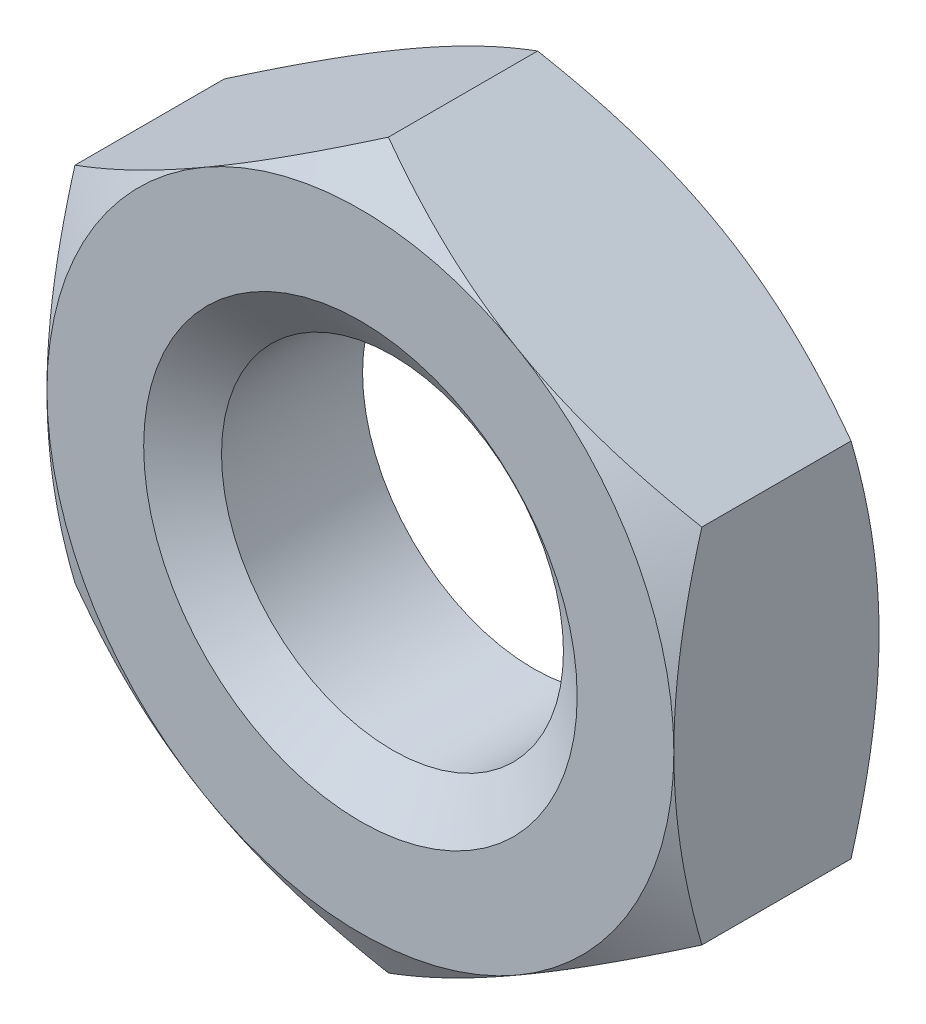
ISO-10303-21;
HEADER;
FILE_DESCRIPTION(('STEP AP214'),'2;1');
FILE_NAME('part.step','',(''),(''),'','','');
FILE_SCHEMA(('AUTOMOTIVE_DESIGN { 1 0 10303 214 1 1 1 1 }'));
ENDSEC;
DATA;
#1=APPLICATION_CONTEXT('core data for automotive mechanical design processes');
#2=APPLICATION_PROTOCOL_DEFINITION('international standard','automotive_design',2000,#1);
#3=PRODUCT_CONTEXT('',#1,'mechanical');
#4=PRODUCT('Part','Part','',(#3));
#5=PRODUCT_RELATED_PRODUCT_CATEGORY('part','',(#4));
#6=PRODUCT_DEFINITION_FORMATION('','',#4);
#7=PRODUCT_DEFINITION_CONTEXT('part definition',#1,'design');
#8=PRODUCT_DEFINITION('design','',#6,#7);
#9=PRODUCT_DEFINITION_SHAPE('','',#8);
#10=(LENGTH_UNIT() NAMED_UNIT(*) SI_UNIT(.MILLI.,.METRE.));
#11=(NAMED_UNIT(*) PLANE_ANGLE_UNIT() SI_UNIT($,.RADIAN.));
#12=(NAMED_UNIT(*) SI_UNIT($,.STERADIAN.) SOLID_ANGLE_UNIT());
#13=UNCERTAINTY_MEASURE_WITH_UNIT(LENGTH_MEASURE(1.E-05),#10,'distance_accuracy_value','');
#14=(GEOMETRIC_REPRESENTATION_CONTEXT(3) GLOBAL_UNCERTAINTY_ASSIGNED_CONTEXT((#13)) GLOBAL_UNIT_ASSIGNED_CONTEXT((#10,
#11,#12)) REPRESENTATION_CONTEXT('',''));
#15=CARTESIAN_POINT('',(0.,0.,0.));
#16=DIRECTION('',(0.,0.,1.));
#17=DIRECTION('',(1.,0.,0.));
#18=AXIS2_PLACEMENT_3D('',#15,#16,#17);
#19=CARTESIAN_POINT('',(0.,0.,-1.8));
#20=DIRECTION('',(0.,0.,1.));
#21=DIRECTION('',(1.,0.,0.));
#22=AXIS2_PLACEMENT_3D('',#19,#20,#21);
#23=CYLINDRICAL_SURFACE('',#22,1.5);
#24=CARTESIAN_POINT('',(0.,0.,-0.28125));
#25=DIRECTION('',(0.,0.,1.));
#26=DIRECTION('',(1.,0.,0.));
#27=AXIS2_PLACEMENT_3D('',#24,#25,#26);
#28=CIRCLE('',#27,1.5);
#29=CARTESIAN_POINT('',(1.5,0.,-0.28125));
#30=VERTEX_POINT('',#29);
#31=EDGE_CURVE('E315',#30,#30,#28,.T.);
#32=ORIENTED_EDGE('',*,*,#31,.T.);
#33=EDGE_LOOP('',(#32));
#34=FACE_BOUND('',#33,.T.);
#35=CARTESIAN_POINT('',(0.,0.,-1.51875));
#36=DIRECTION('',(0.,0.,1.));
#37=DIRECTION('',(1.,0.,0.));
#38=AXIS2_PLACEMENT_3D('',#35,#36,#37);
#39=CIRCLE('',#38,1.5);
#40=CARTESIAN_POINT('',(1.5,0.,-1.51875));
#41=VERTEX_POINT('',#40);
#42=EDGE_CURVE('E318',#41,#41,#39,.T.);
#43=ORIENTED_EDGE('',*,*,#42,.F.);
#44=EDGE_LOOP('',(#43));
#45=FACE_BOUND('',#44,.T.);
#46=ADVANCED_FACE('F32',(#34,#45),#23,.F.);
#47=CARTESIAN_POINT('',(-5.49999999999999,0.,-1.8));
#48=DIRECTION('',(0.,0.,1.));
#49=DIRECTION('',(1.,0.,0.));
#50=AXIS2_PLACEMENT_3D('',#47,#48,#49);
#51=PLANE('',#50);
#52=CARTESIAN_POINT('',(0.,0.,-1.8));
#53=DIRECTION('',(0.,0.,1.));
#54=DIRECTION('',(1.,0.,0.));
#55=AXIS2_PLACEMENT_3D('',#52,#53,#54);
#56=CIRCLE('',#55,2.75);
#57=CARTESIAN_POINT('',(2.75,0.,-1.8));
#58=VERTEX_POINT('',#57);
#59=CARTESIAN_POINT('',(1.375,2.3815698604072,-1.8));
#60=VERTEX_POINT('',#59);
#61=EDGE_CURVE('E202',#58,#60,#56,.T.);
#62=ORIENTED_EDGE('',*,*,#61,.F.);
#63=CARTESIAN_POINT('',(0.,0.,-1.8));
#64=DIRECTION('',(0.,0.,1.));
#65=DIRECTION('',(1.,0.,0.));
#66=AXIS2_PLACEMENT_3D('',#63,#64,#65);
#67=CIRCLE('',#66,2.75);
#68=CARTESIAN_POINT('',(1.375,-2.3815698604072,-1.8));
#69=VERTEX_POINT('',#68);
#70=EDGE_CURVE('E164',#58,#69,#67,.F.);
#71=ORIENTED_EDGE('',*,*,#70,.T.);
#72=CARTESIAN_POINT('',(-1.375,-2.3815698604072,-1.8));
#73=VERTEX_POINT('',#72);
#74=EDGE_CURVE('E166',#69,#73,#67,.F.);
#75=ORIENTED_EDGE('',*,*,#74,.T.);
#76=CARTESIAN_POINT('',(-2.75,0.,-1.8));
#77=VERTEX_POINT('',#76);
#78=EDGE_CURVE('E173',#73,#77,#67,.F.);
#79=ORIENTED_EDGE('',*,*,#78,.T.);
#80=CARTESIAN_POINT('',(-1.375,2.38156986040721,-1.8));
#81=VERTEX_POINT('',#80);
#82=EDGE_CURVE('E175',#77,#81,#67,.F.);
#83=ORIENTED_EDGE('',*,*,#82,.T.);
#84=EDGE_CURVE('E149',#81,#60,#67,.F.);
#85=ORIENTED_EDGE('',*,*,#84,.T.);
#86=EDGE_LOOP('',(#62,#71,#75,#79,#83,#85));
#87=FACE_BOUND('',#86,.T.);
#88=CARTESIAN_POINT('',(0.,0.,-1.8));
#89=DIRECTION('',(0.,0.,1.));
#90=DIRECTION('',(1.,0.,0.));
#91=AXIS2_PLACEMENT_3D('',#88,#89,#90);
#92=CIRCLE('',#91,1.90166662689623);
#93=CARTESIAN_POINT('',(1.90166662689623,0.,-1.8));
#94=VERTEX_POINT('',#93);
#95=EDGE_CURVE('E321',#94,#94,#92,.T.);
#96=ORIENTED_EDGE('',*,*,#95,.T.);
#97=EDGE_LOOP('',(#96));
#98=FACE_BOUND('',#97,.T.);
#99=ADVANCED_FACE('F181',(#87,#98),#51,.F.);
#100=CARTESIAN_POINT('',(0.,3.17542648054294,-1.8));
#101=DIRECTION('',(-0.5,0.866025403784438,0.));
#102=DIRECTION('',(-0.866025403784439,-0.5,0.));
#103=AXIS2_PLACEMENT_3D('',#100,#101,#102);
#104=PLANE('',#103);
#105=DIRECTION('',(0.,0.,1.));
#106=VECTOR('',#105,1.);
#107=CARTESIAN_POINT('',(-2.75,1.58771324027147,-1.8));
#108=LINE('',#107,#106);
#109=CARTESIAN_POINT('',(-2.75,1.58771324027148,-1.55437990693813));
#110=VERTEX_POINT('',#109);
#111=CARTESIAN_POINT('',(-2.75,1.58771324027147,-0.245620093061865));
#112=VERTEX_POINT('',#111);
#113=EDGE_CURVE('E161',#110,#112,#108,.T.);
#114=ORIENTED_EDGE('',*,*,#113,.T.);
#115=CARTESIAN_POINT('',(-2.7502,1.58759777021764,-0.245686763364763));
#116=CARTESIAN_POINT('',(-2.62935077934009,1.65737010029699,-0.205387662249265));
#117=CARTESIAN_POINT('',(-2.50745839737736,1.72774469983533,-0.168736902597664));
#118=CARTESIAN_POINT('',(-2.26156287327211,1.86971254687003,-0.104762182969802));
#119=CARTESIAN_POINT('',(-2.13755536142614,1.94130831721583,-0.077460855674499));
#120=CARTESIAN_POINT('',(-1.89107720202405,2.08361254889599,-0.0349617452941183));
#121=CARTESIAN_POINT('',(-1.76864448141258,2.15429911309864,-0.0194811186224592));
#122=CARTESIAN_POINT('',(-1.52320285763108,2.29600490065923,-0.000999397369941822));
#123=CARTESIAN_POINT('',(-1.40019484676709,2.36702360884404,0.00201700053739881));
#124=CARTESIAN_POINT('',(-1.1703412133892,2.49972966594897,-0.00425314542854845));
#125=CARTESIAN_POINT('',(-1.06346120874598,2.56143686540073,-0.0120001542767042));
#126=CARTESIAN_POINT('',(-0.850397532665249,2.68444923614047,-0.036555181064357));
#127=CARTESIAN_POINT('',(-0.74421459835111,2.74575398185008,-0.0533715896505728));
#128=CARTESIAN_POINT('',(-0.530711510606816,2.86902004703207,-0.0954119223459592));
#129=CARTESIAN_POINT('',(-0.423418383857145,2.93096576264319,-0.120814080687234));
#130=CARTESIAN_POINT('',(-0.210432520715949,3.05393320806134,-0.178467225839985));
#131=CARTESIAN_POINT('',(-0.104737054973348,3.11495651365995,-0.210704663298986));
#132=CARTESIAN_POINT('',(0.000199999999999633,3.17554195059678,-0.245686763364764));
#133=B_SPLINE_CURVE_WITH_KNOTS('',3,(#115,#116,#117,#118,#119,#120,#121,#122,#123,#124,#125,
#126,#127,#128,#129,#130,#131,#132),.UNSPECIFIED.,.F.,.F.,(4,2,2,2,2,2,2,2,4),(0.,
0.435912828725889,0.872873557116333,1.29901931904672,1.72464171213574,2.09526089052938,
2.46622354066374,2.84541551798557,3.22386274754524),.UNSPECIFIED.);
#134=CARTESIAN_POINT('',(-1.375,2.38156986040721,0.));
#135=VERTEX_POINT('',#134);
#136=EDGE_CURVE('E57',#112,#135,#133,.T.);
#137=ORIENTED_EDGE('',*,*,#136,.T.);
#138=CARTESIAN_POINT('',(0.,3.17542648054294,-0.245620093061866));
#139=VERTEX_POINT('',#138);
#140=EDGE_CURVE('E204',#135,#139,#133,.T.);
#141=ORIENTED_EDGE('',*,*,#140,.T.);
#142=DIRECTION('',(0.,0.,1.));
#143=VECTOR('',#142,1.);
#144=CARTESIAN_POINT('',(0.,3.17542648054294,-1.8));
#145=LINE('',#144,#143);
#146=CARTESIAN_POINT('',(0.,3.17542648054294,-1.55437990693813));
#147=VERTEX_POINT('',#146);
#148=EDGE_CURVE('E146',#147,#139,#145,.T.);
#149=ORIENTED_EDGE('',*,*,#148,.F.);
#150=CARTESIAN_POINT('',(-2.7502,1.58759777021764,-1.55431323663524));
#151=CARTESIAN_POINT('',(-2.62935077934009,1.65737010029699,-1.59461233775073));
#152=CARTESIAN_POINT('',(-2.50745839737736,1.72774469983533,-1.63126309740234));
#153=CARTESIAN_POINT('',(-2.26156287327211,1.86971254687003,-1.6952378170302));
#154=CARTESIAN_POINT('',(-2.13755536142614,1.94130831721583,-1.7225391443255));
#155=CARTESIAN_POINT('',(-1.89107720202405,2.08361254889599,-1.76503825470588));
#156=CARTESIAN_POINT('',(-1.76864448141258,2.15429911309864,-1.78051888137754));
#157=CARTESIAN_POINT('',(-1.52320285763108,2.29600490065923,-1.79900060263006));
#158=CARTESIAN_POINT('',(-1.40019484676709,2.36702360884404,-1.8020170005374));
#159=CARTESIAN_POINT('',(-1.1703412133892,2.49972966594897,-1.79574685457145));
#160=CARTESIAN_POINT('',(-1.06346120874598,2.56143686540073,-1.7879998457233));
#161=CARTESIAN_POINT('',(-0.850397532665249,2.68444923614047,-1.76344481893564));
#162=CARTESIAN_POINT('',(-0.74421459835111,2.74575398185008,-1.74662841034943));
#163=CARTESIAN_POINT('',(-0.530711510606816,2.86902004703207,-1.70458807765404));
#164=CARTESIAN_POINT('',(-0.423418383857145,2.93096576264319,-1.67918591931277));
#165=CARTESIAN_POINT('',(-0.210432520715949,3.05393320806134,-1.62153277416001));
#166=CARTESIAN_POINT('',(-0.104737054973347,3.11495651365995,-1.58929533670101));
#167=CARTESIAN_POINT('',(0.000199999999999636,3.17554195059678,-1.55431323663524));
#168=B_SPLINE_CURVE_WITH_KNOTS('',3,(#150,#151,#152,#153,#154,#155,#156,#157,#158,#159,#160,
#161,#162,#163,#164,#165,#166,#167),.UNSPECIFIED.,.F.,.F.,(4,2,2,2,2,2,2,2,4),(0.,
0.435912828725889,0.872873557116333,1.29901931904672,1.72464171213574,2.09526089052938,
2.46622354066374,2.84541551798557,3.22386274754524),.UNSPECIFIED.);
#169=EDGE_CURVE('E163',#81,#147,#168,.T.);
#170=ORIENTED_EDGE('',*,*,#169,.F.);
#171=EDGE_CURVE('E192',#110,#81,#168,.T.);
#172=ORIENTED_EDGE('',*,*,#171,.F.);
#173=EDGE_LOOP('',(#114,#137,#141,#149,#170,#172));
#174=FACE_BOUND('',#173,.T.);
#175=ADVANCED_FACE('F34',(#174),#104,.T.);
#176=CARTESIAN_POINT('',(2.75,1.58771324027147,-1.8));
#177=DIRECTION('',(0.5,0.866025403784438,0.));
#178=DIRECTION('',(-0.866025403784438,0.5,0.));
#179=AXIS2_PLACEMENT_3D('',#176,#177,#178);
#180=PLANE('',#179);
#181=ORIENTED_EDGE('',*,*,#148,.T.);
#182=CARTESIAN_POINT('',(-0.000200000000000583,3.17554195059678,-0.245686763364764));
#183=CARTESIAN_POINT('',(0.120649220659905,3.10576962051743,-0.205387662249266));
#184=CARTESIAN_POINT('',(0.242541602622633,3.03539502097908,-0.168736902597665));
#185=CARTESIAN_POINT('',(0.488437126727893,2.89342717394439,-0.104762182969803));
#186=CARTESIAN_POINT('',(0.612444638573856,2.82183140359859,-0.0774608556744993));
#187=CARTESIAN_POINT('',(0.858922797975944,2.67952717191843,-0.0349617452941183));
#188=CARTESIAN_POINT('',(0.981355518587418,2.60884060771577,-0.019481118622459));
#189=CARTESIAN_POINT('',(1.22679714236892,2.46713482015519,-0.00099939736994136));
#190=CARTESIAN_POINT('',(1.34980515323291,2.39611611197038,0.00201700053739945));
#191=CARTESIAN_POINT('',(1.57965878661079,2.26341005486544,-0.0042531454285476));
#192=CARTESIAN_POINT('',(1.68653879125402,2.20170285541369,-0.0120001542767033));
#193=CARTESIAN_POINT('',(1.89960246733475,2.07869048467395,-0.0365551810643557));
#194=CARTESIAN_POINT('',(2.00578540164889,2.01738573896433,-0.0533715896505712));
#195=CARTESIAN_POINT('',(2.21928848939318,1.89411967378235,-0.0954119223459574));
#196=CARTESIAN_POINT('',(2.32658161614285,1.83217395817123,-0.120814080687232));
#197=CARTESIAN_POINT('',(2.53956747928405,1.70920651275308,-0.178467225839984));
#198=CARTESIAN_POINT('',(2.64526294502665,1.64818320715446,-0.210704663298984));
#199=CARTESIAN_POINT('',(2.7502,1.58759777021763,-0.245686763364762));
#200=B_SPLINE_CURVE_WITH_KNOTS('',3,(#182,#183,#184,#185,#186,#187,#188,#189,#190,#191,#192,
#193,#194,#195,#196,#197,#198,#199),.UNSPECIFIED.,.F.,.F.,(4,2,2,2,2,2,2,2,4),(0.,
0.435912828725889,0.872873557116334,1.29901931904672,1.72464171213574,2.09526089052938,
2.46622354066375,2.84541551798557,3.22386274754524),.UNSPECIFIED.);
#201=CARTESIAN_POINT('',(1.375,2.3815698604072,0.));
#202=VERTEX_POINT('',#201);
#203=EDGE_CURVE('E139',#139,#202,#200,.T.);
#204=ORIENTED_EDGE('',*,*,#203,.T.);
#205=CARTESIAN_POINT('',(2.75,1.58771324027148,-0.245620093061866));
#206=VERTEX_POINT('',#205);
#207=EDGE_CURVE('E125',#202,#206,#200,.T.);
#208=ORIENTED_EDGE('',*,*,#207,.T.);
#209=DIRECTION('',(0.,0.,1.));
#210=VECTOR('',#209,1.);
#211=CARTESIAN_POINT('',(2.75,1.58771324027147,-1.8));
#212=LINE('',#211,#210);
#213=CARTESIAN_POINT('',(2.75,1.58771324027148,-1.55437990693813));
#214=VERTEX_POINT('',#213);
#215=EDGE_CURVE('E138',#214,#206,#212,.T.);
#216=ORIENTED_EDGE('',*,*,#215,.F.);
#217=CARTESIAN_POINT('',(-0.000200000000000583,3.17554195059678,-1.55431323663524));
#218=CARTESIAN_POINT('',(0.120649220659905,3.10576962051743,-1.59461233775073));
#219=CARTESIAN_POINT('',(0.242541602622633,3.03539502097908,-1.63126309740233));
#220=CARTESIAN_POINT('',(0.488437126727893,2.89342717394439,-1.6952378170302));
#221=CARTESIAN_POINT('',(0.612444638573856,2.82183140359859,-1.7225391443255));
#222=CARTESIAN_POINT('',(0.858922797975945,2.67952717191843,-1.76503825470588));
#223=CARTESIAN_POINT('',(0.981355518587418,2.60884060771577,-1.78051888137754));
#224=CARTESIAN_POINT('',(1.22679714236892,2.46713482015519,-1.79900060263006));
#225=CARTESIAN_POINT('',(1.34980515323291,2.39611611197038,-1.8020170005374));
#226=CARTESIAN_POINT('',(1.57965878661079,2.26341005486544,-1.79574685457145));
#227=CARTESIAN_POINT('',(1.68653879125402,2.20170285541369,-1.7879998457233));
#228=CARTESIAN_POINT('',(1.89960246733475,2.07869048467395,-1.76344481893564));
#229=CARTESIAN_POINT('',(2.00578540164889,2.01738573896433,-1.74662841034943));
#230=CARTESIAN_POINT('',(2.21928848939318,1.89411967378235,-1.70458807765404));
#231=CARTESIAN_POINT('',(2.32658161614285,1.83217395817123,-1.67918591931277));
#232=CARTESIAN_POINT('',(2.53956747928405,1.70920651275308,-1.62153277416002));
#233=CARTESIAN_POINT('',(2.64526294502665,1.64818320715446,-1.58929533670102));
#234=CARTESIAN_POINT('',(2.7502,1.58759777021763,-1.55431323663524));
#235=B_SPLINE_CURVE_WITH_KNOTS('',3,(#217,#218,#219,#220,#221,#222,#223,#224,#225,#226,#227,
#228,#229,#230,#231,#232,#233,#234),.UNSPECIFIED.,.F.,.F.,(4,2,2,2,2,2,2,2,4),(0.,
0.435912828725889,0.872873557116334,1.29901931904672,1.72464171213574,2.09526089052938,
2.46622354066375,2.84541551798557,3.22386274754524),.UNSPECIFIED.);
#236=EDGE_CURVE('E252',#60,#214,#235,.T.);
#237=ORIENTED_EDGE('',*,*,#236,.F.);
#238=EDGE_CURVE('E258',#147,#60,#235,.T.);
#239=ORIENTED_EDGE('',*,*,#238,.F.);
#240=EDGE_LOOP('',(#181,#204,#208,#216,#237,#239));
#241=FACE_BOUND('',#240,.T.);
#242=ADVANCED_FACE('F136',(#241),#180,.T.);
#243=CARTESIAN_POINT('',(2.75,1.58771324027147,-1.8));
#244=DIRECTION('',(-1.,0.,0.));
#245=DIRECTION('',(0.,0.,1.));
#246=AXIS2_PLACEMENT_3D('',#243,#244,#245);
#247=PLANE('',#246);
#248=CARTESIAN_POINT('',(2.75,-4.21084949309676,-1.31594843960294));
#249=CARTESIAN_POINT('',(2.75,-4.0901089421409,-1.25759993615225));
#250=CARTESIAN_POINT('',(2.75,-3.96908292065509,-1.19983146511759));
#251=CARTESIAN_POINT('',(2.75,-3.72630558284843,-1.08578603842305));
#252=CARTESIAN_POINT('',(2.75,-3.604554145362,-1.02950934100247));
#253=CARTESIAN_POINT('',(2.75,-3.35951393034354,-0.918482443352761));
#254=CARTESIAN_POINT('',(2.75,-3.23622034236436,-0.863742821605841));
#255=CARTESIAN_POINT('',(2.75,-2.98861980138743,-0.756614777476456));
#256=CARTESIAN_POINT('',(2.75,-2.86431290161182,-0.704226232536766));
#257=CARTESIAN_POINT('',(2.75,-2.61294485887172,-0.601803572146125));
#258=CARTESIAN_POINT('',(2.75,-2.48586863815654,-0.551806257898395));
#259=CARTESIAN_POINT('',(2.75,-2.23021732171541,-0.455727408784602));
#260=CARTESIAN_POINT('',(2.75,-2.10164206103363,-0.409646309576972));
#261=CARTESIAN_POINT('',(2.75,-1.84305218799467,-0.322638077046232));
#262=CARTESIAN_POINT('',(2.75,-1.71304130052583,-0.281699986413889));
#263=CARTESIAN_POINT('',(2.75,-1.45117125062147,-0.206307307624348));
#264=CARTESIAN_POINT('',(2.75,-1.31931268690202,-0.171850669152767));
#265=CARTESIAN_POINT('',(2.75,-1.05365722480012,-0.111093671530904));
#266=CARTESIAN_POINT('',(2.75,-0.91985982021759,-0.0847954840951213));
#267=CARTESIAN_POINT('',(2.75,-0.65065187403738,-0.042126037196611));
#268=CARTESIAN_POINT('',(2.75,-0.515241331013593,-0.0257547865105431));
#269=CARTESIAN_POINT('',(2.75,-0.244373242869209,-0.00438749654023754));
#270=CARTESIAN_POINT('',(2.75,-0.108921526377132,0.000680556773215953));
#271=CARTESIAN_POINT('',(2.75,0.161887058855136,-0.000827795632672006));
#272=CARTESIAN_POINT('',(2.75,0.297243943089642,-0.00740117868555384));
#273=CARTESIAN_POINT('',(2.75,0.528385436717544,-0.0281041300468441));
#274=CARTESIAN_POINT('',(2.75,0.624425050137502,-0.0395376410301886));
#275=CARTESIAN_POINT('',(2.75,0.815762399811544,-0.0675217196133513));
#276=CARTESIAN_POINT('',(2.75,0.911060016631966,-0.0840730942276826));
#277=CARTESIAN_POINT('',(2.75,1.19576218748916,-0.140535361278285));
#278=CARTESIAN_POINT('',(2.75,1.38383224738496,-0.187239859417294));
#279=CARTESIAN_POINT('',(2.75,1.66525048947485,-0.267792497030578));
#280=CARTESIAN_POINT('',(2.75,1.76006556248558,-0.296803334995501));
#281=CARTESIAN_POINT('',(2.75,1.94870609382215,-0.357695648906588));
#282=CARTESIAN_POINT('',(2.75,2.04253218553696,-0.389575144878504));
#283=CARTESIAN_POINT('',(2.75,2.22880240354984,-0.455541418186449));
#284=CARTESIAN_POINT('',(2.75,2.32125133588451,-0.489614761455533));
#285=CARTESIAN_POINT('',(2.75,2.50543192042628,-0.559761368231109));
#286=CARTESIAN_POINT('',(2.75,2.59716326539578,-0.595835440037318));
#287=CARTESIAN_POINT('',(2.75,2.68856293053345,-0.632712441997484));
#288=B_SPLINE_CURVE_WITH_KNOTS('',3,(#248,#249,#250,#251,#252,#253,#254,#255,#256,#257,#258,
#259,#260,#261,#262,#263,#264,#265,#266,#267,#268,#269,#270,#271,#272,#273,#274,#275,#276,#277,
#278,#279,#280,#281,#282,#283,#284,#285,#286,#287),.UNSPECIFIED.,.F.,.F.,(4,2,2,2,2,2,2,2,2,2,2,
2,2,2,2,2,2,2,2,4),(0.,0.402305607365937,0.804680408536997,1.20935783819118,1.61401414820818,
2.0236383818577,2.43330812457349,2.842089694796,3.25074173456636,3.65950246109143,
4.06826354901184,4.4744128402465,4.88045669141172,5.17046846817546,5.46052599902452,
6.04107275309882,6.33851131304661,6.63574613017454,6.93130791005792,7.22698998004822),.UNSPECIFIED.);
#289=CARTESIAN_POINT('',(2.75,-1.58771324027147,-0.245620093061866));
#290=VERTEX_POINT('',#289);
#291=CARTESIAN_POINT('',(2.75,0.,0.));
#292=VERTEX_POINT('',#291);
#293=EDGE_CURVE('E131',#290,#292,#288,.T.);
#294=ORIENTED_EDGE('',*,*,#293,.F.);
#295=DIRECTION('',(0.,0.,1.));
#296=VECTOR('',#295,1.);
#297=CARTESIAN_POINT('',(2.75,-1.58771324027147,-1.8));
#298=LINE('',#297,#296);
#299=CARTESIAN_POINT('',(2.75,-1.58771324027147,-1.55437990693813));
#300=VERTEX_POINT('',#299);
#301=EDGE_CURVE('E147',#300,#290,#298,.T.);
#302=ORIENTED_EDGE('',*,*,#301,.F.);
#303=CARTESIAN_POINT('',(2.75,-4.21084949309676,-0.484051560397056));
#304=CARTESIAN_POINT('',(2.75,-4.0901089421409,-0.542400063847753));
#305=CARTESIAN_POINT('',(2.75,-3.96908292065509,-0.60016853488241));
#306=CARTESIAN_POINT('',(2.75,-3.72630558284844,-0.714213961576946));
#307=CARTESIAN_POINT('',(2.75,-3.604554145362,-0.770490658997525));
#308=CARTESIAN_POINT('',(2.75,-3.35951393034354,-0.881517556647239));
#309=CARTESIAN_POINT('',(2.75,-3.23622034236436,-0.936257178394159));
#310=CARTESIAN_POINT('',(2.75,-2.98861980138743,-1.04338522252354));
#311=CARTESIAN_POINT('',(2.75,-2.86431290161182,-1.09577376746323));
#312=CARTESIAN_POINT('',(2.75,-2.61294485887172,-1.19819642785387));
#313=CARTESIAN_POINT('',(2.75,-2.48586863815654,-1.2481937421016));
#314=CARTESIAN_POINT('',(2.75,-2.23021732171541,-1.3442725912154));
#315=CARTESIAN_POINT('',(2.75,-2.10164206103363,-1.39035369042303));
#316=CARTESIAN_POINT('',(2.75,-1.84305218799467,-1.47736192295377));
#317=CARTESIAN_POINT('',(2.75,-1.71304130052583,-1.51830001358611));
#318=CARTESIAN_POINT('',(2.75,-1.45117125062147,-1.59369269237565));
#319=CARTESIAN_POINT('',(2.75,-1.31931268690202,-1.62814933084723));
#320=CARTESIAN_POINT('',(2.75,-1.05365722480012,-1.6889063284691));
#321=CARTESIAN_POINT('',(2.75,-0.91985982021759,-1.71520451590488));
#322=CARTESIAN_POINT('',(2.75,-0.65065187403738,-1.75787396280339));
#323=CARTESIAN_POINT('',(2.75,-0.515241331013593,-1.77424521348946));
#324=CARTESIAN_POINT('',(2.75,-0.244373242869209,-1.79561250345976));
#325=CARTESIAN_POINT('',(2.75,-0.108921526377131,-1.80068055677322));
#326=CARTESIAN_POINT('',(2.75,0.161887058855136,-1.79917220436733));
#327=CARTESIAN_POINT('',(2.75,0.297243943089643,-1.79259882131445));
#328=CARTESIAN_POINT('',(2.75,0.528385436717544,-1.77189586995316));
#329=CARTESIAN_POINT('',(2.75,0.624425050137502,-1.76046235896981));
#330=CARTESIAN_POINT('',(2.75,0.815762399811544,-1.73247828038665));
#331=CARTESIAN_POINT('',(2.75,0.911060016631966,-1.71592690577232));
#332=CARTESIAN_POINT('',(2.75,1.19576218748916,-1.65946463872172));
#333=CARTESIAN_POINT('',(2.75,1.38383224738496,-1.61276014058271));
#334=CARTESIAN_POINT('',(2.75,1.66525048947485,-1.53220750296942));
#335=CARTESIAN_POINT('',(2.75,1.76006556248558,-1.5031966650045));
#336=CARTESIAN_POINT('',(2.75,1.94870609382215,-1.44230435109341));
#337=CARTESIAN_POINT('',(2.75,2.04253218553695,-1.4104248551215));
#338=CARTESIAN_POINT('',(2.75,2.22880240354984,-1.34445858181355));
#339=CARTESIAN_POINT('',(2.75,2.32125133588451,-1.31038523854447));
#340=CARTESIAN_POINT('',(2.75,2.50543192042628,-1.24023863176889));
#341=CARTESIAN_POINT('',(2.75,2.59716326539578,-1.20416455996268));
#342=CARTESIAN_POINT('',(2.75,2.68856293053345,-1.16728755800252));
#343=B_SPLINE_CURVE_WITH_KNOTS('',3,(#303,#304,#305,#306,#307,#308,#309,#310,#311,#312,#313,
#314,#315,#316,#317,#318,#319,#320,#321,#322,#323,#324,#325,#326,#327,#328,#329,#330,#331,#332,
#333,#334,#335,#336,#337,#338,#339,#340,#341,#342),.UNSPECIFIED.,.F.,.F.,(4,2,2,2,2,2,2,2,2,2,2,
2,2,2,2,2,2,2,2,4),(0.,0.402305607365936,0.804680408536997,1.20935783819118,1.61401414820818,
2.0236383818577,2.43330812457349,2.842089694796,3.25074173456636,3.65950246109143,
4.06826354901184,4.4744128402465,4.88045669141172,5.17046846817546,5.46052599902452,
6.04107275309883,6.33851131304661,6.63574613017454,6.93130791005791,7.22698998004822),.UNSPECIFIED.);
#344=EDGE_CURVE('E241',#300,#58,#343,.T.);
#345=ORIENTED_EDGE('',*,*,#344,.T.);
#346=EDGE_CURVE('E145',#58,#214,#343,.T.);
#347=ORIENTED_EDGE('',*,*,#346,.T.);
#348=ORIENTED_EDGE('',*,*,#215,.T.);
#349=EDGE_CURVE('E122',#292,#206,#288,.T.);
#350=ORIENTED_EDGE('',*,*,#349,.F.);
#351=EDGE_LOOP('',(#294,#302,#345,#347,#348,#350));
#352=FACE_BOUND('',#351,.T.);
#353=ADVANCED_FACE('F142',(#352),#247,.F.);
#354=CARTESIAN_POINT('',(0.,-3.17542648054295,-1.8));
#355=DIRECTION('',(0.500000000000001,-0.866025403784438,0.));
#356=DIRECTION('',(0.866025403784438,0.500000000000001,0.));
#357=AXIS2_PLACEMENT_3D('',#354,#355,#356);
#358=PLANE('',#357);
#359=ORIENTED_EDGE('',*,*,#301,.T.);
#360=CARTESIAN_POINT('',(2.7502,-1.58759777021763,-0.245686763364762));
#361=CARTESIAN_POINT('',(2.62935077934009,-1.65737010029699,-0.205387662249265));
#362=CARTESIAN_POINT('',(2.50745839737737,-1.72774469983533,-0.168736902597664));
#363=CARTESIAN_POINT('',(2.26156287327211,-1.86971254687003,-0.104762182969802));
#364=CARTESIAN_POINT('',(2.13755536142614,-1.94130831721583,-0.0774608556744985));
#365=CARTESIAN_POINT('',(1.89107720202405,-2.08361254889599,-0.0349617452941179));
#366=CARTESIAN_POINT('',(1.76864448141258,-2.15429911309864,-0.019481118622459));
#367=CARTESIAN_POINT('',(1.52320285763108,-2.29600490065923,-0.000999397369942022));
#368=CARTESIAN_POINT('',(1.40019484676709,-2.36702360884404,0.00201700053739849));
#369=CARTESIAN_POINT('',(1.1703412133892,-2.49972966594897,-0.00425314542854888));
#370=CARTESIAN_POINT('',(1.06346120874598,-2.56143686540073,-0.0120001542767047));
#371=CARTESIAN_POINT('',(0.850397532665248,-2.68444923614047,-0.0365551810643577));
#372=CARTESIAN_POINT('',(0.744214598351109,-2.74575398185008,-0.0533715896505736));
#373=CARTESIAN_POINT('',(0.530711510606815,-2.86902004703207,-0.0954119223459603));
#374=CARTESIAN_POINT('',(0.423418383857144,-2.93096576264319,-0.120814080687235));
#375=CARTESIAN_POINT('',(0.210432520715948,-3.05393320806134,-0.178467225839987));
#376=CARTESIAN_POINT('',(0.104737054973346,-3.11495651365996,-0.210704663298988));
#377=CARTESIAN_POINT('',(-0.000200000000000865,-3.17554195059679,-0.245686763364766));
#378=B_SPLINE_CURVE_WITH_KNOTS('',3,(#360,#361,#362,#363,#364,#365,#366,#367,#368,#369,#370,
#371,#372,#373,#374,#375,#376,#377),.UNSPECIFIED.,.F.,.F.,(4,2,2,2,2,2,2,2,4),(0.,
0.435912828725888,0.872873557116334,1.29901931904672,1.72464171213574,2.09526089052938,
2.46622354066375,2.84541551798557,3.22386274754525),.UNSPECIFIED.);
#379=CARTESIAN_POINT('',(1.375,-2.3815698604072,0.));
#380=VERTEX_POINT('',#379);
#381=EDGE_CURVE('E279',#290,#380,#378,.T.);
#382=ORIENTED_EDGE('',*,*,#381,.T.);
#383=CARTESIAN_POINT('',(0.,-3.17542648054294,-0.245620093061866));
#384=VERTEX_POINT('',#383);
#385=EDGE_CURVE('E280',#380,#384,#378,.T.);
#386=ORIENTED_EDGE('',*,*,#385,.T.);
#387=DIRECTION('',(0.,0.,1.));
#388=VECTOR('',#387,1.);
#389=CARTESIAN_POINT('',(0.,-3.17542648054295,-1.8));
#390=LINE('',#389,#388);
#391=CARTESIAN_POINT('',(0.,-3.17542648054294,-1.55437990693813));
#392=VERTEX_POINT('',#391);
#393=EDGE_CURVE('E152',#392,#384,#390,.T.);
#394=ORIENTED_EDGE('',*,*,#393,.F.);
#395=CARTESIAN_POINT('',(2.7502,-1.58759777021763,-1.55431323663524));
#396=CARTESIAN_POINT('',(2.62935077934009,-1.65737010029699,-1.59461233775073));
#397=CARTESIAN_POINT('',(2.50745839737737,-1.72774469983533,-1.63126309740234));
#398=CARTESIAN_POINT('',(2.26156287327211,-1.86971254687003,-1.6952378170302));
#399=CARTESIAN_POINT('',(2.13755536142614,-1.94130831721583,-1.7225391443255));
#400=CARTESIAN_POINT('',(1.89107720202405,-2.08361254889599,-1.76503825470588));
#401=CARTESIAN_POINT('',(1.76864448141258,-2.15429911309864,-1.78051888137754));
#402=CARTESIAN_POINT('',(1.52320285763108,-2.29600490065923,-1.79900060263006));
#403=CARTESIAN_POINT('',(1.40019484676709,-2.36702360884404,-1.8020170005374));
#404=CARTESIAN_POINT('',(1.1703412133892,-2.49972966594897,-1.79574685457145));
#405=CARTESIAN_POINT('',(1.06346120874598,-2.56143686540073,-1.78799984572329));
#406=CARTESIAN_POINT('',(0.850397532665248,-2.68444923614047,-1.76344481893564));
#407=CARTESIAN_POINT('',(0.744214598351109,-2.74575398185008,-1.74662841034943));
#408=CARTESIAN_POINT('',(0.530711510606815,-2.86902004703207,-1.70458807765404));
#409=CARTESIAN_POINT('',(0.423418383857144,-2.93096576264319,-1.67918591931276));
#410=CARTESIAN_POINT('',(0.210432520715948,-3.05393320806134,-1.62153277416001));
#411=CARTESIAN_POINT('',(0.104737054973346,-3.11495651365996,-1.58929533670101));
#412=CARTESIAN_POINT('',(-0.000200000000000864,-3.17554195059679,-1.55431323663523));
#413=B_SPLINE_CURVE_WITH_KNOTS('',3,(#395,#396,#397,#398,#399,#400,#401,#402,#403,#404,#405,
#406,#407,#408,#409,#410,#411,#412),.UNSPECIFIED.,.F.,.F.,(4,2,2,2,2,2,2,2,4),(0.,
0.435912828725888,0.872873557116334,1.29901931904672,1.72464171213574,2.09526089052938,
2.46622354066375,2.84541551798557,3.22386274754525),.UNSPECIFIED.);
#414=EDGE_CURVE('E234',#69,#392,#413,.T.);
#415=ORIENTED_EDGE('',*,*,#414,.F.);
#416=EDGE_CURVE('E352',#300,#69,#413,.T.);
#417=ORIENTED_EDGE('',*,*,#416,.F.);
#418=EDGE_LOOP('',(#359,#382,#386,#394,#415,#417));
#419=FACE_BOUND('',#418,.T.);
#420=ADVANCED_FACE('F294',(#419),#358,.T.);
#421=CARTESIAN_POINT('',(-2.75,-1.58771324027147,-1.8));
#422=DIRECTION('',(-0.500000000000002,-0.866025403784438,0.));
#423=DIRECTION('',(0.866025403784438,-0.500000000000002,0.));
#424=AXIS2_PLACEMENT_3D('',#421,#422,#423);
#425=PLANE('',#424);
#426=ORIENTED_EDGE('',*,*,#393,.T.);
#427=CARTESIAN_POINT('',(0.000199999999999499,-3.17554195059679,-0.245686763364766));
#428=CARTESIAN_POINT('',(-0.120649220659906,-3.10576962051743,-0.205387662249268));
#429=CARTESIAN_POINT('',(-0.242541602622635,-3.03539502097909,-0.168736902597667));
#430=CARTESIAN_POINT('',(-0.488437126727894,-2.89342717394439,-0.104762182969804));
#431=CARTESIAN_POINT('',(-0.612444638573857,-2.82183140359859,-0.0774608556745004));
#432=CARTESIAN_POINT('',(-0.858922797975946,-2.67952717191843,-0.0349617452941192));
#433=CARTESIAN_POINT('',(-0.981355518587419,-2.60884060771577,-0.0194811186224599));
#434=CARTESIAN_POINT('',(-1.22679714236892,-2.46713482015519,-0.000999397369942161));
#435=CARTESIAN_POINT('',(-1.34980515323291,-2.39611611197038,0.00201700053739868));
#436=CARTESIAN_POINT('',(-1.5796587866108,-2.26341005486544,-0.00425314542854809));
#437=CARTESIAN_POINT('',(-1.68653879125402,-2.20170285541369,-0.0120001542767036));
#438=CARTESIAN_POINT('',(-1.89960246733475,-2.07869048467395,-0.0365551810643559));
#439=CARTESIAN_POINT('',(-2.00578540164889,-2.01738573896433,-0.0533715896505715));
#440=CARTESIAN_POINT('',(-2.21928848939318,-1.89411967378235,-0.0954119223459577));
#441=CARTESIAN_POINT('',(-2.32658161614286,-1.83217395817123,-0.120814080687232));
#442=CARTESIAN_POINT('',(-2.53956747928405,-1.70920651275307,-0.178467225839983));
#443=CARTESIAN_POINT('',(-2.64526294502665,-1.64818320715446,-0.210704663298984));
#444=CARTESIAN_POINT('',(-2.7502,-1.58759777021763,-0.245686763364762));
#445=B_SPLINE_CURVE_WITH_KNOTS('',3,(#427,#428,#429,#430,#431,#432,#433,#434,#435,#436,#437,
#438,#439,#440,#441,#442,#443,#444),.UNSPECIFIED.,.F.,.F.,(4,2,2,2,2,2,2,2,4),(0.,
0.43591282872589,0.872873557116335,1.29901931904672,1.72464171213574,2.09526089052938,
2.46622354066375,2.84541551798558,3.22386274754525),.UNSPECIFIED.);
#446=CARTESIAN_POINT('',(-1.375,-2.3815698604072,0.));
#447=VERTEX_POINT('',#446);
#448=EDGE_CURVE('E287',#384,#447,#445,.T.);
#449=ORIENTED_EDGE('',*,*,#448,.T.);
#450=CARTESIAN_POINT('',(-2.75,-1.58771324027148,-0.245620093061866));
#451=VERTEX_POINT('',#450);
#452=EDGE_CURVE('E288',#447,#451,#445,.T.);
#453=ORIENTED_EDGE('',*,*,#452,.T.);
#454=DIRECTION('',(0.,0.,1.));
#455=VECTOR('',#454,1.);
#456=CARTESIAN_POINT('',(-2.75,-1.58771324027147,-1.8));
#457=LINE('',#456,#455);
#458=CARTESIAN_POINT('',(-2.75,-1.58771324027148,-1.55437990693813));
#459=VERTEX_POINT('',#458);
#460=EDGE_CURVE('E158',#459,#451,#457,.T.);
#461=ORIENTED_EDGE('',*,*,#460,.F.);
#462=CARTESIAN_POINT('',(0.000199999999999499,-3.17554195059679,-1.55431323663523));
#463=CARTESIAN_POINT('',(-0.120649220659906,-3.10576962051743,-1.59461233775073));
#464=CARTESIAN_POINT('',(-0.242541602622634,-3.03539502097909,-1.63126309740233));
#465=CARTESIAN_POINT('',(-0.488437126727894,-2.89342717394439,-1.69523781703019));
#466=CARTESIAN_POINT('',(-0.612444638573857,-2.82183140359859,-1.7225391443255));
#467=CARTESIAN_POINT('',(-0.858922797975945,-2.67952717191843,-1.76503825470588));
#468=CARTESIAN_POINT('',(-0.981355518587419,-2.60884060771577,-1.78051888137754));
#469=CARTESIAN_POINT('',(-1.22679714236892,-2.46713482015519,-1.79900060263006));
#470=CARTESIAN_POINT('',(-1.34980515323291,-2.39611611197038,-1.8020170005374));
#471=CARTESIAN_POINT('',(-1.5796587866108,-2.26341005486544,-1.79574685457145));
#472=CARTESIAN_POINT('',(-1.68653879125402,-2.20170285541369,-1.7879998457233));
#473=CARTESIAN_POINT('',(-1.89960246733475,-2.07869048467395,-1.76344481893564));
#474=CARTESIAN_POINT('',(-2.00578540164889,-2.01738573896433,-1.74662841034943));
#475=CARTESIAN_POINT('',(-2.21928848939318,-1.89411967378235,-1.70458807765404));
#476=CARTESIAN_POINT('',(-2.32658161614285,-1.83217395817123,-1.67918591931277));
#477=CARTESIAN_POINT('',(-2.53956747928405,-1.70920651275307,-1.62153277416002));
#478=CARTESIAN_POINT('',(-2.64526294502665,-1.64818320715446,-1.58929533670102));
#479=CARTESIAN_POINT('',(-2.7502,-1.58759777021763,-1.55431323663524));
#480=B_SPLINE_CURVE_WITH_KNOTS('',3,(#462,#463,#464,#465,#466,#467,#468,#469,#470,#471,#472,
#473,#474,#475,#476,#477,#478,#479),.UNSPECIFIED.,.F.,.F.,(4,2,2,2,2,2,2,2,4),(0.,
0.43591282872589,0.872873557116335,1.29901931904672,1.72464171213574,2.09526089052938,
2.46622354066375,2.84541551798558,3.22386274754525),.UNSPECIFIED.);
#481=EDGE_CURVE('E196',#73,#459,#480,.T.);
#482=ORIENTED_EDGE('',*,*,#481,.F.);
#483=EDGE_CURVE('E353',#392,#73,#480,.T.);
#484=ORIENTED_EDGE('',*,*,#483,.F.);
#485=EDGE_LOOP('',(#426,#449,#453,#461,#482,#484));
#486=FACE_BOUND('',#485,.T.);
#487=ADVANCED_FACE('F297',(#486),#425,.T.);
#488=CARTESIAN_POINT('',(-2.75,1.58771324027147,-1.8));
#489=DIRECTION('',(-1.,0.,0.));
#490=DIRECTION('',(0.,0.,1.));
#491=AXIS2_PLACEMENT_3D('',#488,#489,#490);
#492=PLANE('',#491);
#493=ORIENTED_EDGE('',*,*,#460,.T.);
#494=CARTESIAN_POINT('',(-2.75,-4.21084949309675,-1.31594843960294));
#495=CARTESIAN_POINT('',(-2.75,-4.09010894214089,-1.25759993615224));
#496=CARTESIAN_POINT('',(-2.75,-3.96908292065509,-1.19983146511759));
#497=CARTESIAN_POINT('',(-2.75,-3.72630558284843,-1.08578603842305));
#498=CARTESIAN_POINT('',(-2.75,-3.604554145362,-1.02950934100247));
#499=CARTESIAN_POINT('',(-2.75,-3.35951393034354,-0.91848244335276));
#500=CARTESIAN_POINT('',(-2.75,-3.23622034236436,-0.86374282160584));
#501=CARTESIAN_POINT('',(-2.75,-2.98861980138743,-0.756614777476455));
#502=CARTESIAN_POINT('',(-2.75,-2.86431290161182,-0.704226232536765));
#503=CARTESIAN_POINT('',(-2.75,-2.61294485887172,-0.601803572146125));
#504=CARTESIAN_POINT('',(-2.75,-2.48586863815654,-0.551806257898394));
#505=CARTESIAN_POINT('',(-2.75,-2.2302173217154,-0.455727408784602));
#506=CARTESIAN_POINT('',(-2.75,-2.10164206103363,-0.409646309576972));
#507=CARTESIAN_POINT('',(-2.75,-1.84305218799467,-0.322638077046231));
#508=CARTESIAN_POINT('',(-2.75,-1.71304130052583,-0.281699986413888));
#509=CARTESIAN_POINT('',(-2.75,-1.45117125062147,-0.206307307624348));
#510=CARTESIAN_POINT('',(-2.75,-1.31931268690202,-0.171850669152767));
#511=CARTESIAN_POINT('',(-2.75,-1.05365722480012,-0.111093671530904));
#512=CARTESIAN_POINT('',(-2.75,-0.919859820217589,-0.0847954840951212));
#513=CARTESIAN_POINT('',(-2.75,-0.650651874037378,-0.042126037196611));
#514=CARTESIAN_POINT('',(-2.75,-0.515241331013592,-0.0257547865105428));
#515=CARTESIAN_POINT('',(-2.75,-0.244373242869208,-0.00438749654023726));
#516=CARTESIAN_POINT('',(-2.75,-0.10892152637713,0.000680556773216008));
#517=CARTESIAN_POINT('',(-2.75,0.161887058855137,-0.000827795632672059));
#518=CARTESIAN_POINT('',(-2.75,0.297243943089644,-0.00740117868555376));
#519=CARTESIAN_POINT('',(-2.75,0.528385436717546,-0.0281041300468442));
#520=CARTESIAN_POINT('',(-2.75,0.624425050137504,-0.0395376410301889));
#521=CARTESIAN_POINT('',(-2.75,0.815762399811546,-0.0675217196133519));
#522=CARTESIAN_POINT('',(-2.75,0.911060016631969,-0.0840730942276831));
#523=CARTESIAN_POINT('',(-2.75,1.19576218748917,-0.140535361278285));
#524=CARTESIAN_POINT('',(-2.75,1.38383224738497,-0.187239859417294));
#525=CARTESIAN_POINT('',(-2.75,1.66525048947485,-0.267792497030579));
#526=CARTESIAN_POINT('',(-2.75,1.76006556248558,-0.296803334995502));
#527=CARTESIAN_POINT('',(-2.75,1.94870609382215,-0.357695648906589));
#528=CARTESIAN_POINT('',(-2.75,2.04253218553696,-0.389575144878504));
#529=CARTESIAN_POINT('',(-2.75,2.22880240354984,-0.455541418186449));
#530=CARTESIAN_POINT('',(-2.75,2.32125133588451,-0.489614761455533));
#531=CARTESIAN_POINT('',(-2.75,2.50543192042628,-0.55976136823111));
#532=CARTESIAN_POINT('',(-2.75,2.59716326539579,-0.595835440037319));
#533=CARTESIAN_POINT('',(-2.75,2.68856293053345,-0.632712441997485));
#534=B_SPLINE_CURVE_WITH_KNOTS('',3,(#494,#495,#496,#497,#498,#499,#500,#501,#502,#503,#504,
#505,#506,#507,#508,#509,#510,#511,#512,#513,#514,#515,#516,#517,#518,#519,#520,#521,#522,#523,
#524,#525,#526,#527,#528,#529,#530,#531,#532,#533),.UNSPECIFIED.,.F.,.F.,(4,2,2,2,2,2,2,2,2,2,2,
2,2,2,2,2,2,2,2,4),(0.,0.402305607365936,0.804680408536997,1.20935783819118,1.61401414820818,
2.0236383818577,2.43330812457349,2.842089694796,3.25074173456636,3.65950246109143,
4.06826354901184,4.4744128402465,4.88045669141172,5.17046846817546,5.46052599902452,
6.04107275309883,6.33851131304661,6.63574613017454,6.93130791005792,7.22698998004822),.UNSPECIFIED.);
#535=CARTESIAN_POINT('',(-2.75,0.,0.));
#536=VERTEX_POINT('',#535);
#537=EDGE_CURVE('E334',#451,#536,#534,.T.);
#538=ORIENTED_EDGE('',*,*,#537,.T.);
#539=EDGE_CURVE('E329',#536,#112,#534,.T.);
#540=ORIENTED_EDGE('',*,*,#539,.T.);
#541=ORIENTED_EDGE('',*,*,#113,.F.);
#542=CARTESIAN_POINT('',(-2.75,-4.21084949309675,-0.484051560397057));
#543=CARTESIAN_POINT('',(-2.75,-4.09010894214089,-0.542400063847754));
#544=CARTESIAN_POINT('',(-2.75,-3.96908292065509,-0.600168534882411));
#545=CARTESIAN_POINT('',(-2.75,-3.72630558284843,-0.714213961576947));
#546=CARTESIAN_POINT('',(-2.75,-3.604554145362,-0.770490658997526));
#547=CARTESIAN_POINT('',(-2.75,-3.35951393034354,-0.88151755664724));
#548=CARTESIAN_POINT('',(-2.75,-3.23622034236436,-0.936257178394159));
#549=CARTESIAN_POINT('',(-2.75,-2.98861980138743,-1.04338522252354));
#550=CARTESIAN_POINT('',(-2.75,-2.86431290161182,-1.09577376746323));
#551=CARTESIAN_POINT('',(-2.75,-2.61294485887172,-1.19819642785387));
#552=CARTESIAN_POINT('',(-2.75,-2.48586863815654,-1.24819374210161));
#553=CARTESIAN_POINT('',(-2.75,-2.2302173217154,-1.3442725912154));
#554=CARTESIAN_POINT('',(-2.75,-2.10164206103363,-1.39035369042303));
#555=CARTESIAN_POINT('',(-2.75,-1.84305218799467,-1.47736192295377));
#556=CARTESIAN_POINT('',(-2.75,-1.71304130052583,-1.51830001358611));
#557=CARTESIAN_POINT('',(-2.75,-1.45117125062147,-1.59369269237565));
#558=CARTESIAN_POINT('',(-2.75,-1.31931268690202,-1.62814933084723));
#559=CARTESIAN_POINT('',(-2.75,-1.05365722480012,-1.6889063284691));
#560=CARTESIAN_POINT('',(-2.75,-0.919859820217589,-1.71520451590488));
#561=CARTESIAN_POINT('',(-2.75,-0.650651874037378,-1.75787396280339));
#562=CARTESIAN_POINT('',(-2.75,-0.515241331013592,-1.77424521348946));
#563=CARTESIAN_POINT('',(-2.75,-0.244373242869208,-1.79561250345976));
#564=CARTESIAN_POINT('',(-2.75,-0.10892152637713,-1.80068055677322));
#565=CARTESIAN_POINT('',(-2.75,0.161887058855138,-1.79917220436733));
#566=CARTESIAN_POINT('',(-2.75,0.297243943089644,-1.79259882131445));
#567=CARTESIAN_POINT('',(-2.75,0.528385436717545,-1.77189586995316));
#568=CARTESIAN_POINT('',(-2.75,0.624425050137503,-1.76046235896981));
#569=CARTESIAN_POINT('',(-2.75,0.815762399811545,-1.73247828038665));
#570=CARTESIAN_POINT('',(-2.75,0.911060016631968,-1.71592690577232));
#571=CARTESIAN_POINT('',(-2.75,1.19576218748916,-1.65946463872171));
#572=CARTESIAN_POINT('',(-2.75,1.38383224738497,-1.61276014058271));
#573=CARTESIAN_POINT('',(-2.75,1.66525048947485,-1.53220750296942));
#574=CARTESIAN_POINT('',(-2.75,1.76006556248558,-1.5031966650045));
#575=CARTESIAN_POINT('',(-2.75,1.94870609382215,-1.44230435109341));
#576=CARTESIAN_POINT('',(-2.75,2.04253218553696,-1.4104248551215));
#577=CARTESIAN_POINT('',(-2.75,2.22880240354984,-1.34445858181355));
#578=CARTESIAN_POINT('',(-2.75,2.32125133588451,-1.31038523854447));
#579=CARTESIAN_POINT('',(-2.75,2.50543192042628,-1.24023863176889));
#580=CARTESIAN_POINT('',(-2.75,2.59716326539578,-1.20416455996268));
#581=CARTESIAN_POINT('',(-2.75,2.68856293053345,-1.16728755800252));
#582=B_SPLINE_CURVE_WITH_KNOTS('',3,(#542,#543,#544,#545,#546,#547,#548,#549,#550,#551,#552,
#553,#554,#555,#556,#557,#558,#559,#560,#561,#562,#563,#564,#565,#566,#567,#568,#569,#570,#571,
#572,#573,#574,#575,#576,#577,#578,#579,#580,#581),.UNSPECIFIED.,.F.,.F.,(4,2,2,2,2,2,2,2,2,2,2,
2,2,2,2,2,2,2,2,4),(0.,0.402305607365936,0.804680408536997,1.20935783819118,1.61401414820818,
2.0236383818577,2.43330812457349,2.842089694796,3.25074173456636,3.65950246109143,
4.06826354901184,4.4744128402465,4.88045669141172,5.17046846817546,5.46052599902452,
6.04107275309882,6.33851131304661,6.63574613017454,6.93130791005791,7.22698998004822),.UNSPECIFIED.);
#583=EDGE_CURVE('E190',#77,#110,#582,.T.);
#584=ORIENTED_EDGE('',*,*,#583,.F.);
#585=EDGE_CURVE('E194',#459,#77,#582,.T.);
#586=ORIENTED_EDGE('',*,*,#585,.F.);
#587=EDGE_LOOP('',(#493,#538,#540,#541,#584,#586));
#588=FACE_BOUND('',#587,.T.);
#589=ADVANCED_FACE('F201',(#588),#492,.T.);
#590=CARTESIAN_POINT('',(-5.49999999999999,0.,0.));
#591=DIRECTION('',(0.,0.,1.));
#592=DIRECTION('',(1.,0.,0.));
#593=AXIS2_PLACEMENT_3D('',#590,#591,#592);
#594=PLANE('',#593);
#595=CARTESIAN_POINT('',(0.,0.,0.));
#596=DIRECTION('',(0.,0.,1.));
#597=DIRECTION('',(1.,0.,0.));
#598=AXIS2_PLACEMENT_3D('',#595,#596,#597);
#599=CIRCLE('',#598,1.90166662689622);
#600=CARTESIAN_POINT('',(1.90166662689622,0.,0.));
#601=VERTEX_POINT('',#600);
#602=EDGE_CURVE('E320',#601,#601,#599,.T.);
#603=ORIENTED_EDGE('',*,*,#602,.F.);
#604=EDGE_LOOP('',(#603));
#605=FACE_BOUND('',#604,.T.);
#606=CARTESIAN_POINT('',(0.,0.,0.));
#607=DIRECTION('',(0.,0.,1.));
#608=DIRECTION('',(1.,0.,0.));
#609=AXIS2_PLACEMENT_3D('',#606,#607,#608);
#610=CIRCLE('',#609,2.75);
#611=EDGE_CURVE('E37',#380,#292,#610,.T.);
#612=ORIENTED_EDGE('',*,*,#611,.T.);
#613=CARTESIAN_POINT('',(0.,0.,0.));
#614=DIRECTION('',(0.,0.,1.));
#615=DIRECTION('',(1.,0.,0.));
#616=AXIS2_PLACEMENT_3D('',#613,#614,#615);
#617=CIRCLE('',#616,2.75);
#618=EDGE_CURVE('E49',#292,#202,#617,.T.);
#619=ORIENTED_EDGE('',*,*,#618,.T.);
#620=EDGE_CURVE('E11',#202,#135,#610,.T.);
#621=ORIENTED_EDGE('',*,*,#620,.T.);
#622=EDGE_CURVE('E42',#135,#536,#610,.T.);
#623=ORIENTED_EDGE('',*,*,#622,.T.);
#624=EDGE_CURVE('E380',#536,#447,#610,.T.);
#625=ORIENTED_EDGE('',*,*,#624,.T.);
#626=EDGE_CURVE('E172',#447,#380,#610,.T.);
#627=ORIENTED_EDGE('',*,*,#626,.T.);
#628=EDGE_LOOP('',(#612,#619,#621,#623,#625,#627));
#629=FACE_BOUND('',#628,.T.);
#630=ADVANCED_FACE('F262',(#605,#629),#594,.T.);
#631=CARTESIAN_POINT('',(0.,0.,-1.8));
#632=DIRECTION('',(0.,0.,1.));
#633=DIRECTION('',(1.,0.,0.));
#634=AXIS2_PLACEMENT_3D('',#631,#632,#633);
#635=CONICAL_SURFACE('',#634,2.75,1.0471975511966);
#636=ORIENTED_EDGE('',*,*,#236,.T.);
#637=ORIENTED_EDGE('',*,*,#346,.F.);
#638=ORIENTED_EDGE('',*,*,#61,.T.);
#639=EDGE_LOOP('',(#636,#637,#638));
#640=FACE_BOUND('',#639,.T.);
#641=ADVANCED_FACE('F360',(#640),#635,.T.);
#642=ORIENTED_EDGE('',*,*,#169,.T.);
#643=ORIENTED_EDGE('',*,*,#238,.T.);
#644=ORIENTED_EDGE('',*,*,#84,.F.);
#645=EDGE_LOOP('',(#642,#643,#644));
#646=FACE_BOUND('',#645,.T.);
#647=ADVANCED_FACE('F224',(#646),#635,.T.);
#648=ORIENTED_EDGE('',*,*,#171,.T.);
#649=ORIENTED_EDGE('',*,*,#82,.F.);
#650=ORIENTED_EDGE('',*,*,#583,.T.);
#651=EDGE_LOOP('',(#648,#649,#650));
#652=FACE_BOUND('',#651,.T.);
#653=ADVANCED_FACE('F188',(#652),#635,.T.);
#654=ORIENTED_EDGE('',*,*,#481,.T.);
#655=ORIENTED_EDGE('',*,*,#585,.T.);
#656=ORIENTED_EDGE('',*,*,#78,.F.);
#657=EDGE_LOOP('',(#654,#655,#656));
#658=FACE_BOUND('',#657,.T.);
#659=ADVANCED_FACE('F195',(#658),#635,.T.);
#660=ORIENTED_EDGE('',*,*,#414,.T.);
#661=ORIENTED_EDGE('',*,*,#483,.T.);
#662=ORIENTED_EDGE('',*,*,#74,.F.);
#663=EDGE_LOOP('',(#660,#661,#662));
#664=FACE_BOUND('',#663,.T.);
#665=ADVANCED_FACE('F223',(#664),#635,.T.);
#666=ORIENTED_EDGE('',*,*,#416,.T.);
#667=ORIENTED_EDGE('',*,*,#70,.F.);
#668=ORIENTED_EDGE('',*,*,#344,.F.);
#669=EDGE_LOOP('',(#666,#667,#668));
#670=FACE_BOUND('',#669,.T.);
#671=ADVANCED_FACE('F356',(#670),#635,.T.);
#672=CARTESIAN_POINT('',(0.,0.,0.));
#673=DIRECTION('',(0.,0.,-1.));
#674=DIRECTION('',(-1.,0.,0.));
#675=AXIS2_PLACEMENT_3D('',#672,#673,#674);
#676=CONICAL_SURFACE('',#675,2.75,1.0471975511966);
#677=ORIENTED_EDGE('',*,*,#293,.T.);
#678=ORIENTED_EDGE('',*,*,#611,.F.);
#679=ORIENTED_EDGE('',*,*,#381,.F.);
#680=EDGE_LOOP('',(#677,#678,#679));
#681=FACE_BOUND('',#680,.T.);
#682=ADVANCED_FACE('F350',(#681),#676,.T.);
#683=ORIENTED_EDGE('',*,*,#626,.F.);
#684=ORIENTED_EDGE('',*,*,#448,.F.);
#685=ORIENTED_EDGE('',*,*,#385,.F.);
#686=EDGE_LOOP('',(#683,#684,#685));
#687=FACE_BOUND('',#686,.T.);
#688=ADVANCED_FACE('F342',(#687),#676,.T.);
#689=ORIENTED_EDGE('',*,*,#624,.F.);
#690=ORIENTED_EDGE('',*,*,#537,.F.);
#691=ORIENTED_EDGE('',*,*,#452,.F.);
#692=EDGE_LOOP('',(#689,#690,#691));
#693=FACE_BOUND('',#692,.T.);
#694=ADVANCED_FACE('F225',(#693),#676,.T.);
#695=ORIENTED_EDGE('',*,*,#539,.F.);
#696=ORIENTED_EDGE('',*,*,#622,.F.);
#697=ORIENTED_EDGE('',*,*,#136,.F.);
#698=EDGE_LOOP('',(#695,#696,#697));
#699=FACE_BOUND('',#698,.T.);
#700=ADVANCED_FACE('F377',(#699),#676,.T.);
#701=ORIENTED_EDGE('',*,*,#620,.F.);
#702=ORIENTED_EDGE('',*,*,#203,.F.);
#703=ORIENTED_EDGE('',*,*,#140,.F.);
#704=EDGE_LOOP('',(#701,#702,#703));
#705=FACE_BOUND('',#704,.T.);
#706=ADVANCED_FACE('F375',(#705),#676,.T.);
#707=ORIENTED_EDGE('',*,*,#618,.F.);
#708=ORIENTED_EDGE('',*,*,#349,.T.);
#709=ORIENTED_EDGE('',*,*,#207,.F.);
#710=EDGE_LOOP('',(#707,#708,#709));
#711=FACE_BOUND('',#710,.T.);
#712=ADVANCED_FACE('F124',(#711),#676,.T.);
#713=CARTESIAN_POINT('',(0.,0.,-0.28125));
#714=DIRECTION('',(0.,0.,1.));
#715=DIRECTION('',(1.,0.,0.));
#716=AXIS2_PLACEMENT_3D('',#713,#714,#715);
#717=CONICAL_SURFACE('',#716,1.5,0.959931088596887);
#718=ORIENTED_EDGE('',*,*,#602,.T.);
#719=EDGE_LOOP('',(#718));
#720=FACE_BOUND('',#719,.T.);
#721=ORIENTED_EDGE('',*,*,#31,.F.);
#722=EDGE_LOOP('',(#721));
#723=FACE_BOUND('',#722,.T.);
#724=ADVANCED_FACE('F391',(#720,#723),#717,.F.);
#725=CARTESIAN_POINT('',(0.,0.,-1.8));
#726=DIRECTION('',(0.,0.,-1.));
#727=DIRECTION('',(-1.,0.,0.));
#728=AXIS2_PLACEMENT_3D('',#725,#726,#727);
#729=CONICAL_SURFACE('',#728,1.90166662689623,0.959931088596887);
#730=ORIENTED_EDGE('',*,*,#42,.T.);
#731=EDGE_LOOP('',(#730));
#732=FACE_BOUND('',#731,.T.);
#733=ORIENTED_EDGE('',*,*,#95,.F.);
#734=EDGE_LOOP('',(#733));
#735=FACE_BOUND('',#734,.T.);
#736=ADVANCED_FACE('F395',(#732,#735),#729,.F.);
#737=CLOSED_SHELL('',(#46,#99,#175,#242,#353,#420,#487,#589,#630,#641,#647,#653,#659,#665,#671,
#682,#688,#694,#700,#706,#712,#724,#736));
#738=MANIFOLD_SOLID_BREP('B2',#737);
#739=ADVANCED_BREP_SHAPE_REPRESENTATION('',(#18,#738),#14);
#740=SHAPE_DEFINITION_REPRESENTATION(#9,#739);
ENDSEC;
END-ISO-10303-21;
